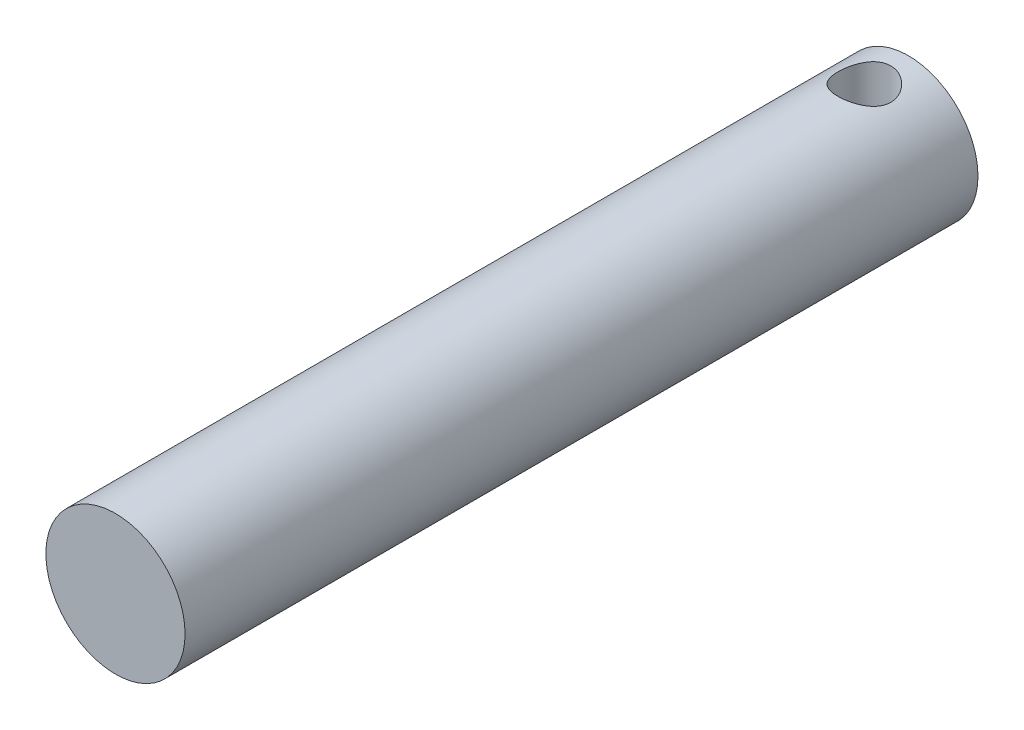
ISO-10303-21;
HEADER;
FILE_DESCRIPTION(('STEP AP214'),'2;1');
FILE_NAME('part.step','',(''),(''),'','','');
FILE_SCHEMA(('AUTOMOTIVE_DESIGN { 1 0 10303 214 1 1 1 1 }'));
ENDSEC;
DATA;
#1=APPLICATION_CONTEXT('core data for automotive mechanical design processes');
#2=APPLICATION_PROTOCOL_DEFINITION('international standard','automotive_design',2000,#1);
#3=PRODUCT_CONTEXT('',#1,'mechanical');
#4=PRODUCT('Part','Part','',(#3));
#5=PRODUCT_RELATED_PRODUCT_CATEGORY('part','',(#4));
#6=PRODUCT_DEFINITION_FORMATION('','',#4);
#7=PRODUCT_DEFINITION_CONTEXT('part definition',#1,'design');
#8=PRODUCT_DEFINITION('design','',#6,#7);
#9=PRODUCT_DEFINITION_SHAPE('','',#8);
#10=(LENGTH_UNIT() NAMED_UNIT(*) SI_UNIT(.MILLI.,.METRE.));
#11=(NAMED_UNIT(*) PLANE_ANGLE_UNIT() SI_UNIT($,.RADIAN.));
#12=(NAMED_UNIT(*) SI_UNIT($,.STERADIAN.) SOLID_ANGLE_UNIT());
#13=UNCERTAINTY_MEASURE_WITH_UNIT(LENGTH_MEASURE(1.E-05),#10,'distance_accuracy_value','');
#14=(GEOMETRIC_REPRESENTATION_CONTEXT(3) GLOBAL_UNCERTAINTY_ASSIGNED_CONTEXT((#13)) GLOBAL_UNIT_ASSIGNED_CONTEXT((#10,
#11,#12)) REPRESENTATION_CONTEXT('',''));
#15=CARTESIAN_POINT('',(0.,0.,0.));
#16=DIRECTION('',(0.,0.,1.));
#17=DIRECTION('',(1.,0.,0.));
#18=AXIS2_PLACEMENT_3D('',#15,#16,#17);
#19=CARTESIAN_POINT('',(0.,0.,45.));
#20=DIRECTION('',(0.,0.,-1.));
#21=DIRECTION('',(-1.,0.,0.));
#22=AXIS2_PLACEMENT_3D('',#19,#20,#21);
#23=CYLINDRICAL_SURFACE('',#22,3.95);
#24=CARTESIAN_POINT('',(0.,-3.95,4.));
#25=CARTESIAN_POINT('',(0.0811617815811666,-3.95000246423025,4.00000325980464));
#26=CARTESIAN_POINT('',(0.162301535252579,-3.94747692057941,3.9933923005655));
#27=CARTESIAN_POINT('',(0.322152156556649,-3.93765495034082,3.96723341394977));
#28=CARTESIAN_POINT('',(0.400863439175337,-3.9303593436606,3.94768770986901));
#29=CARTESIAN_POINT('',(0.553528379370291,-3.91177915589985,3.89645298010913));
#30=CARTESIAN_POINT('',(0.627491027818303,-3.90050239261796,3.86478774338189));
#31=CARTESIAN_POINT('',(0.769047921052426,-3.87507983438869,3.79033541130457));
#32=CARTESIAN_POINT('',(0.836640405810823,-3.86093324991531,3.74754525442667));
#33=CARTESIAN_POINT('',(0.966471156629173,-3.83054225825794,3.65011994595346));
#34=CARTESIAN_POINT('',(1.02839663010838,-3.81423744371699,3.5950869879755));
#35=CARTESIAN_POINT('',(1.14239282345194,-3.78166099907107,3.47558274671781));
#36=CARTESIAN_POINT('',(1.19446041423529,-3.76538938111918,3.41110847806339));
#37=CARTESIAN_POINT('',(1.28927736588135,-3.73401398078341,3.27146601770689));
#38=CARTESIAN_POINT('',(1.33158053229797,-3.71898114726717,3.19597731512257));
#39=CARTESIAN_POINT('',(1.40275089909039,-3.69272794187969,3.03829641042984));
#40=CARTESIAN_POINT('',(1.4316236218315,-3.68150600354779,2.9561069799115));
#41=CARTESIAN_POINT('',(1.47387146311147,-3.66479230083167,2.79096176410347));
#42=CARTESIAN_POINT('',(1.48784461418746,-3.65908037345018,2.70818201445619));
#43=CARTESIAN_POINT('',(1.50176628455813,-3.65339025344221,2.54127074599387));
#44=CARTESIAN_POINT('',(1.50172078700814,-3.65340961470321,2.45713981919169));
#45=CARTESIAN_POINT('',(1.48806295710611,-3.65899043707136,2.2954355252905));
#46=CARTESIAN_POINT('',(1.47528681308602,-3.66421030935272,2.21777753618627));
#47=CARTESIAN_POINT('',(1.43791492544864,-3.67903527048589,2.06580384922501));
#48=CARTESIAN_POINT('',(1.41331735518505,-3.68864103703443,1.99148866984021));
#49=CARTESIAN_POINT('',(1.35255174967744,-3.7113568161833,1.84662905126136));
#50=CARTESIAN_POINT('',(1.31617045134499,-3.72453062170343,1.77618451670211));
#51=CARTESIAN_POINT('',(1.23301895504521,-3.75287757684805,1.6421602194791));
#52=CARTESIAN_POINT('',(1.18624510661525,-3.76805142824025,1.57858288066087));
#53=CARTESIAN_POINT('',(1.07983401918453,-3.79996669448741,1.45547850849779));
#54=CARTESIAN_POINT('',(1.01953151628169,-3.81674399721295,1.39653439938688));
#55=CARTESIAN_POINT('',(0.889707000533638,-3.84907678626741,1.28941973112024));
#56=CARTESIAN_POINT('',(0.820183500518316,-3.86463207486312,1.24125091318631));
#57=CARTESIAN_POINT('',(0.672372866509568,-3.89309160461547,1.15638915134723));
#58=CARTESIAN_POINT('',(0.593961887425363,-3.90594875832478,1.11989499829021));
#59=CARTESIAN_POINT('',(0.431503233402173,-3.92721288313064,1.06081053438666));
#60=CARTESIAN_POINT('',(0.347458147885976,-3.93562188300249,1.03821388420919));
#61=CARTESIAN_POINT('',(0.181019358168979,-3.94668316532938,1.00869729363654));
#62=CARTESIAN_POINT('',(0.0987838184371941,-3.94962326207423,1.00099268370335));
#63=CARTESIAN_POINT('',(-0.0658484188422501,-3.95030808331666,0.999188111557818));
#64=CARTESIAN_POINT('',(-0.148245075272563,-3.94805399477933,1.00508504114852));
#65=CARTESIAN_POINT('',(-0.307439139320348,-3.93879337991991,1.02972321111739));
#66=CARTESIAN_POINT('',(-0.384329055931249,-3.93197863870352,1.04794642422939));
#67=CARTESIAN_POINT('',(-0.533902812536535,-3.91447598982543,1.09603357646476));
#68=CARTESIAN_POINT('',(-0.606586104673498,-3.90378757897977,1.12589902793581));
#69=CARTESIAN_POINT('',(-0.748100456960508,-3.87919571538646,1.19738100611381));
#70=CARTESIAN_POINT('',(-0.816753375616012,-3.86520632506889,1.23931972774247));
#71=CARTESIAN_POINT('',(-0.946279722984481,-3.83555430611658,1.33339489618932));
#72=CARTESIAN_POINT('',(-1.00715021481212,-3.81989104987798,1.38553517413784));
#73=CARTESIAN_POINT('',(-1.12317542104201,-3.78745573568432,1.50218286461653));
#74=CARTESIAN_POINT('',(-1.17777432736766,-3.77067316884195,1.56724163784371));
#75=CARTESIAN_POINT('',(-1.27539449178067,-3.73878505042412,1.70592231183037));
#76=CARTESIAN_POINT('',(-1.31841456447384,-3.72367967064523,1.77954508823371));
#77=CARTESIAN_POINT('',(-1.39173794731388,-3.69690477310384,1.93395830976576));
#78=CARTESIAN_POINT('',(-1.42197546453807,-3.68525312159584,2.01478330652174));
#79=CARTESIAN_POINT('',(-1.46820591462573,-3.66708334920172,2.18094583816915));
#80=CARTESIAN_POINT('',(-1.48420796839581,-3.66056194159037,2.26628044648491));
#81=CARTESIAN_POINT('',(-1.50068729605358,-3.65383488479413,2.43300008962116));
#82=CARTESIAN_POINT('',(-1.50211546930355,-3.65324244229976,2.51427626866799));
#83=CARTESIAN_POINT('',(-1.49185402669504,-3.65744471125336,2.67584647429504));
#84=CARTESIAN_POINT('',(-1.48016572182043,-3.66223888431249,2.75614059822025));
#85=CARTESIAN_POINT('',(-1.44475053048199,-3.67634857357546,2.9108461055281));
#86=CARTESIAN_POINT('',(-1.42142215471701,-3.68551400394507,2.98536359063461));
#87=CARTESIAN_POINT('',(-1.36374399545923,-3.70724255338848,3.12946801900431));
#88=CARTESIAN_POINT('',(-1.32939139287098,-3.71980654140611,3.19905369555155));
#89=CARTESIAN_POINT('',(-1.24851386477786,-3.74775054457848,3.33535872777333));
#90=CARTESIAN_POINT('',(-1.20143714064455,-3.76324506615304,3.40172689068347));
#91=CARTESIAN_POINT('',(-1.097292857738,-3.79491875800486,3.52592463311559));
#92=CARTESIAN_POINT('',(-1.0402220828135,-3.81109814740231,3.58375145290036));
#93=CARTESIAN_POINT('',(-0.913887615377485,-3.84340816976698,3.69253399786873));
#94=CARTESIAN_POINT('',(-0.844119742919367,-3.85948522124532,3.7429227896516));
#95=CARTESIAN_POINT('',(-0.696540038845534,-3.88882862344932,3.83125036629803));
#96=CARTESIAN_POINT('',(-0.618727230582498,-3.90209463231962,3.86918763721991));
#97=CARTESIAN_POINT('',(-0.4527760423607,-3.92490342051498,3.93293687831517));
#98=CARTESIAN_POINT('',(-0.364306841726193,-3.93420607969871,3.95798225507417));
#99=CARTESIAN_POINT('',(-0.183881078128035,-3.9467513511917,3.99150753399583));
#100=CARTESIAN_POINT('',(-0.0919264097607361,-3.94999720893459,3.99999630784181));
#101=CARTESIAN_POINT('',(0.,-3.95,4.));
#102=B_SPLINE_CURVE_WITH_KNOTS('',3,(#24,#25,#26,#27,#28,#29,#30,#31,#32,#33,#34,#35,#36,#37,
#38,#39,#40,#41,#42,#43,#44,#45,#46,#47,#48,#49,#50,#51,#52,#53,#54,#55,#56,#57,#58,#59,#60,#61,
#62,#63,#64,#65,#66,#67,#68,#69,#70,#71,#72,#73,#74,#75,#76,#77,#78,#79,#80,#81,#82,#83,#84,#85,
#86,#87,#88,#89,#90,#91,#92,#93,#94,#95,#96,#97,#98,#99,#100,#101),.UNSPECIFIED.,.T.,.F.,(4,2,2,
2,2,2,2,2,2,2,2,2,2,2,2,2,2,2,2,2,2,2,2,2,2,2,2,2,2,2,2,2,2,2,2,2,2,2,4),(0.,0.243146193662999,
0.486250604858372,0.728880263111798,0.971576762759165,1.22376512608258,1.47603340511197,
1.73820774038463,2.0002741786208,2.25137261277041,2.50236387832667,2.73788855879893,
2.97344964424191,3.21353744444613,3.45370971102292,3.71046812044702,3.96726799055133,
4.22823275106617,4.48907838432733,4.73575910951624,4.98238346929788,5.21923881371646,
5.45612493632833,5.70003546666739,5.94403777249991,6.20256240562959,6.4611134954077,
6.72097962813659,6.98067913998999,7.22331650944357,7.46592962960195,7.70075432825632,
7.93563912377423,8.1830600032545,8.43056065121199,8.69193629902898,8.95334371493506,
9.22888649827886,9.5042815942832),.UNSPECIFIED.);
#103=CARTESIAN_POINT('',(0.,-3.95,4.));
#104=VERTEX_POINT('',#103);
#105=EDGE_CURVE('E10',#104,#104,#102,.T.);
#106=ORIENTED_EDGE('',*,*,#105,.T.);
#107=EDGE_LOOP('',(#106));
#108=FACE_BOUND('',#107,.T.);
#109=CARTESIAN_POINT('',(0.,3.95,4.));
#110=CARTESIAN_POINT('',(-0.0811617815811666,3.95000246423025,4.00000325980464));
#111=CARTESIAN_POINT('',(-0.162301535252579,3.94747692057941,3.9933923005655));
#112=CARTESIAN_POINT('',(-0.322152156556649,3.93765495034082,3.96723341394977));
#113=CARTESIAN_POINT('',(-0.400863439175337,3.9303593436606,3.94768770986901));
#114=CARTESIAN_POINT('',(-0.553528379370291,3.91177915589985,3.89645298010913));
#115=CARTESIAN_POINT('',(-0.627491027818303,3.90050239261796,3.86478774338189));
#116=CARTESIAN_POINT('',(-0.769047921052426,3.87507983438869,3.79033541130457));
#117=CARTESIAN_POINT('',(-0.836640405810823,3.86093324991531,3.74754525442667));
#118=CARTESIAN_POINT('',(-0.966471156629173,3.83054225825794,3.65011994595346));
#119=CARTESIAN_POINT('',(-1.02839663010838,3.81423744371699,3.5950869879755));
#120=CARTESIAN_POINT('',(-1.14239282345194,3.78166099907107,3.47558274671781));
#121=CARTESIAN_POINT('',(-1.19446041423529,3.76538938111918,3.41110847806339));
#122=CARTESIAN_POINT('',(-1.28927736588135,3.73401398078341,3.27146601770689));
#123=CARTESIAN_POINT('',(-1.33158053229797,3.71898114726717,3.19597731512257));
#124=CARTESIAN_POINT('',(-1.40275089909039,3.69272794187969,3.03829641042984));
#125=CARTESIAN_POINT('',(-1.4316236218315,3.68150600354779,2.9561069799115));
#126=CARTESIAN_POINT('',(-1.47387146311147,3.66479230083167,2.79096176410347));
#127=CARTESIAN_POINT('',(-1.48784461418746,3.65908037345018,2.70818201445619));
#128=CARTESIAN_POINT('',(-1.50176628455813,3.65339025344221,2.54127074599387));
#129=CARTESIAN_POINT('',(-1.50172078700814,3.65340961470321,2.45713981919169));
#130=CARTESIAN_POINT('',(-1.48806295710611,3.65899043707136,2.2954355252905));
#131=CARTESIAN_POINT('',(-1.47528681308602,3.66421030935272,2.21777753618627));
#132=CARTESIAN_POINT('',(-1.43791492544864,3.67903527048589,2.06580384922501));
#133=CARTESIAN_POINT('',(-1.41331735518505,3.68864103703443,1.99148866984021));
#134=CARTESIAN_POINT('',(-1.35255174967744,3.7113568161833,1.84662905126136));
#135=CARTESIAN_POINT('',(-1.31617045134499,3.72453062170343,1.77618451670211));
#136=CARTESIAN_POINT('',(-1.23301895504521,3.75287757684805,1.6421602194791));
#137=CARTESIAN_POINT('',(-1.18624510661525,3.76805142824025,1.57858288066087));
#138=CARTESIAN_POINT('',(-1.07983401918453,3.79996669448741,1.45547850849779));
#139=CARTESIAN_POINT('',(-1.01953151628169,3.81674399721295,1.39653439938688));
#140=CARTESIAN_POINT('',(-0.889707000533638,3.84907678626741,1.28941973112024));
#141=CARTESIAN_POINT('',(-0.820183500518316,3.86463207486312,1.24125091318631));
#142=CARTESIAN_POINT('',(-0.672372866509568,3.89309160461547,1.15638915134723));
#143=CARTESIAN_POINT('',(-0.593961887425363,3.90594875832478,1.11989499829021));
#144=CARTESIAN_POINT('',(-0.431503233402173,3.92721288313064,1.06081053438666));
#145=CARTESIAN_POINT('',(-0.347458147885976,3.93562188300249,1.03821388420919));
#146=CARTESIAN_POINT('',(-0.181019358168979,3.94668316532938,1.00869729363654));
#147=CARTESIAN_POINT('',(-0.0987838184371941,3.94962326207423,1.00099268370335));
#148=CARTESIAN_POINT('',(0.0658484188422501,3.95030808331666,0.999188111557818));
#149=CARTESIAN_POINT('',(0.148245075272563,3.94805399477933,1.00508504114852));
#150=CARTESIAN_POINT('',(0.307439139320348,3.93879337991991,1.02972321111739));
#151=CARTESIAN_POINT('',(0.384329055931249,3.93197863870352,1.04794642422939));
#152=CARTESIAN_POINT('',(0.533902812536535,3.91447598982543,1.09603357646476));
#153=CARTESIAN_POINT('',(0.606586104673498,3.90378757897977,1.12589902793581));
#154=CARTESIAN_POINT('',(0.748100456960508,3.87919571538646,1.19738100611381));
#155=CARTESIAN_POINT('',(0.816753375616012,3.86520632506889,1.23931972774247));
#156=CARTESIAN_POINT('',(0.946279722984481,3.83555430611658,1.33339489618932));
#157=CARTESIAN_POINT('',(1.00715021481212,3.81989104987798,1.38553517413784));
#158=CARTESIAN_POINT('',(1.12317542104201,3.78745573568432,1.50218286461653));
#159=CARTESIAN_POINT('',(1.17777432736766,3.77067316884195,1.56724163784371));
#160=CARTESIAN_POINT('',(1.27539449178067,3.73878505042412,1.70592231183037));
#161=CARTESIAN_POINT('',(1.31841456447384,3.72367967064523,1.77954508823371));
#162=CARTESIAN_POINT('',(1.39173794731388,3.69690477310384,1.93395830976576));
#163=CARTESIAN_POINT('',(1.42197546453807,3.68525312159584,2.01478330652174));
#164=CARTESIAN_POINT('',(1.46820591462573,3.66708334920172,2.18094583816915));
#165=CARTESIAN_POINT('',(1.48420796839581,3.66056194159037,2.26628044648491));
#166=CARTESIAN_POINT('',(1.50068729605358,3.65383488479413,2.43300008962116));
#167=CARTESIAN_POINT('',(1.50211546930355,3.65324244229976,2.51427626866799));
#168=CARTESIAN_POINT('',(1.49185402669504,3.65744471125336,2.67584647429504));
#169=CARTESIAN_POINT('',(1.48016572182043,3.66223888431249,2.75614059822025));
#170=CARTESIAN_POINT('',(1.44475053048199,3.67634857357546,2.9108461055281));
#171=CARTESIAN_POINT('',(1.42142215471701,3.68551400394507,2.98536359063461));
#172=CARTESIAN_POINT('',(1.36374399545923,3.70724255338848,3.12946801900431));
#173=CARTESIAN_POINT('',(1.32939139287098,3.71980654140611,3.19905369555155));
#174=CARTESIAN_POINT('',(1.24851386477786,3.74775054457848,3.33535872777333));
#175=CARTESIAN_POINT('',(1.20143714064455,3.76324506615304,3.40172689068347));
#176=CARTESIAN_POINT('',(1.097292857738,3.79491875800486,3.52592463311559));
#177=CARTESIAN_POINT('',(1.0402220828135,3.81109814740231,3.58375145290036));
#178=CARTESIAN_POINT('',(0.913887615377485,3.84340816976698,3.69253399786873));
#179=CARTESIAN_POINT('',(0.844119742919367,3.85948522124532,3.7429227896516));
#180=CARTESIAN_POINT('',(0.696540038845534,3.88882862344932,3.83125036629803));
#181=CARTESIAN_POINT('',(0.618727230582498,3.90209463231962,3.86918763721991));
#182=CARTESIAN_POINT('',(0.4527760423607,3.92490342051498,3.93293687831517));
#183=CARTESIAN_POINT('',(0.364306841726193,3.93420607969871,3.95798225507417));
#184=CARTESIAN_POINT('',(0.183881078128035,3.9467513511917,3.99150753399583));
#185=CARTESIAN_POINT('',(0.0919264097607361,3.94999720893459,3.99999630784181));
#186=CARTESIAN_POINT('',(0.,3.95,4.));
#187=B_SPLINE_CURVE_WITH_KNOTS('',3,(#109,#110,#111,#112,#113,#114,#115,#116,#117,#118,#119,
#120,#121,#122,#123,#124,#125,#126,#127,#128,#129,#130,#131,#132,#133,#134,#135,#136,#137,#138,
#139,#140,#141,#142,#143,#144,#145,#146,#147,#148,#149,#150,#151,#152,#153,#154,#155,#156,#157,
#158,#159,#160,#161,#162,#163,#164,#165,#166,#167,#168,#169,#170,#171,#172,#173,#174,#175,#176,
#177,#178,#179,#180,#181,#182,#183,#184,#185,#186),.UNSPECIFIED.,.T.,.F.,(4,2,2,2,2,2,2,2,2,2,2,
2,2,2,2,2,2,2,2,2,2,2,2,2,2,2,2,2,2,2,2,2,2,2,2,2,2,2,4),(0.,0.243146193662999,
0.486250604858372,0.728880263111798,0.971576762759165,1.22376512608258,1.47603340511197,
1.73820774038463,2.0002741786208,2.25137261277041,2.50236387832667,2.73788855879893,
2.97344964424191,3.21353744444613,3.45370971102292,3.71046812044702,3.96726799055133,
4.22823275106617,4.48907838432733,4.73575910951624,4.98238346929788,5.21923881371646,
5.45612493632833,5.70003546666739,5.94403777249991,6.20256240562959,6.4611134954077,
6.72097962813659,6.98067913998999,7.22331650944357,7.46592962960195,7.70075432825632,
7.93563912377423,8.1830600032545,8.43056065121199,8.69193629902898,8.95334371493506,
9.22888649827886,9.5042815942832),.UNSPECIFIED.);
#188=CARTESIAN_POINT('',(0.,3.95,4.));
#189=VERTEX_POINT('',#188);
#190=EDGE_CURVE('E53',#189,#189,#187,.T.);
#191=ORIENTED_EDGE('',*,*,#190,.T.);
#192=EDGE_LOOP('',(#191));
#193=FACE_BOUND('',#192,.T.);
#194=CARTESIAN_POINT('',(0.,0.,45.));
#195=DIRECTION('',(0.,0.,1.));
#196=DIRECTION('',(1.,0.,0.));
#197=AXIS2_PLACEMENT_3D('',#194,#195,#196);
#198=CIRCLE('',#197,3.95);
#199=CARTESIAN_POINT('',(3.95,0.,45.));
#200=VERTEX_POINT('',#199);
#201=EDGE_CURVE('E58',#200,#200,#198,.T.);
#202=ORIENTED_EDGE('',*,*,#201,.F.);
#203=EDGE_LOOP('',(#202));
#204=FACE_BOUND('',#203,.T.);
#205=CARTESIAN_POINT('',(0.,0.,0.));
#206=DIRECTION('',(0.,0.,1.));
#207=DIRECTION('',(1.,0.,0.));
#208=AXIS2_PLACEMENT_3D('',#205,#206,#207);
#209=CIRCLE('',#208,3.95);
#210=CARTESIAN_POINT('',(3.95,0.,0.));
#211=VERTEX_POINT('',#210);
#212=EDGE_CURVE('E63',#211,#211,#209,.T.);
#213=ORIENTED_EDGE('',*,*,#212,.T.);
#214=EDGE_LOOP('',(#213));
#215=FACE_BOUND('',#214,.T.);
#216=ADVANCED_FACE('F41',(#108,#193,#204,#215),#23,.T.);
#217=CARTESIAN_POINT('',(0.,0.,45.));
#218=DIRECTION('',(0.,0.,1.));
#219=DIRECTION('',(1.,0.,0.));
#220=AXIS2_PLACEMENT_3D('',#217,#218,#219);
#221=PLANE('',#220);
#222=ORIENTED_EDGE('',*,*,#201,.T.);
#223=EDGE_LOOP('',(#222));
#224=FACE_BOUND('',#223,.T.);
#225=ADVANCED_FACE('F75',(#224),#221,.T.);
#226=CARTESIAN_POINT('',(0.,0.,0.));
#227=DIRECTION('',(0.,0.,1.));
#228=DIRECTION('',(1.,0.,0.));
#229=AXIS2_PLACEMENT_3D('',#226,#227,#228);
#230=PLANE('',#229);
#231=ORIENTED_EDGE('',*,*,#212,.F.);
#232=EDGE_LOOP('',(#231));
#233=FACE_BOUND('',#232,.T.);
#234=ADVANCED_FACE('F73',(#233),#230,.F.);
#235=CARTESIAN_POINT('',(0.,-3.95,2.5));
#236=DIRECTION('',(0.,1.,0.));
#237=DIRECTION('',(0.,0.,1.));
#238=AXIS2_PLACEMENT_3D('',#235,#236,#237);
#239=CYLINDRICAL_SURFACE('',#238,1.5);
#240=ORIENTED_EDGE('',*,*,#190,.F.);
#241=EDGE_LOOP('',(#240));
#242=FACE_BOUND('',#241,.T.);
#243=ORIENTED_EDGE('',*,*,#105,.F.);
#244=EDGE_LOOP('',(#243));
#245=FACE_BOUND('',#244,.T.);
#246=ADVANCED_FACE('F69',(#242,#245),#239,.F.);
#247=CLOSED_SHELL('',(#216,#225,#234,#246));
#248=MANIFOLD_SOLID_BREP('B2',#247);
#249=ADVANCED_BREP_SHAPE_REPRESENTATION('',(#18,#248),#14);
#250=SHAPE_DEFINITION_REPRESENTATION(#9,#249);
ENDSEC;
END-ISO-10303-21;
